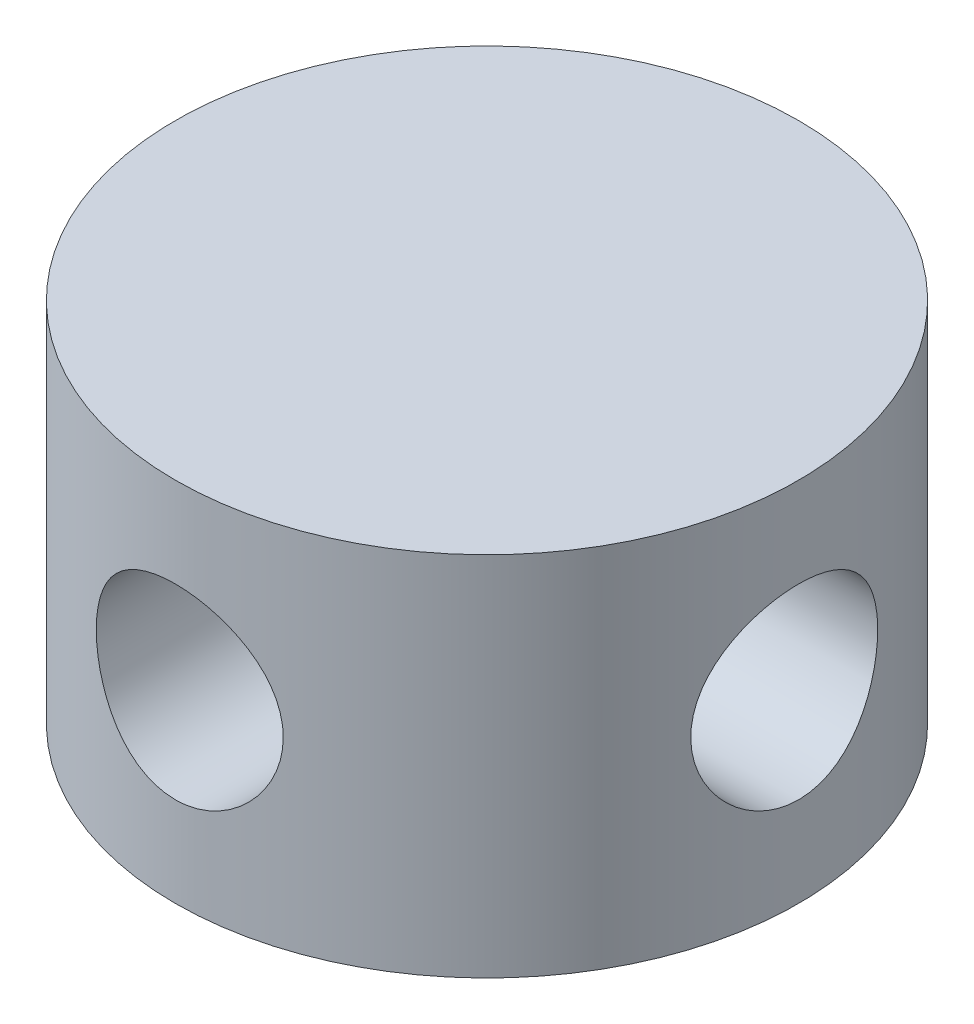
ISO-10303-21;
HEADER;
FILE_DESCRIPTION(('STEP AP214'),'2;1');
FILE_NAME('part.step','',(''),(''),'','','');
FILE_SCHEMA(('AUTOMOTIVE_DESIGN { 1 0 10303 214 1 1 1 1 }'));
ENDSEC;
DATA;
#1=APPLICATION_CONTEXT('core data for automotive mechanical design processes');
#2=APPLICATION_PROTOCOL_DEFINITION('international standard','automotive_design',2000,#1);
#3=PRODUCT_CONTEXT('',#1,'mechanical');
#4=PRODUCT('Part','Part','',(#3));
#5=PRODUCT_RELATED_PRODUCT_CATEGORY('part','',(#4));
#6=PRODUCT_DEFINITION_FORMATION('','',#4);
#7=PRODUCT_DEFINITION_CONTEXT('part definition',#1,'design');
#8=PRODUCT_DEFINITION('design','',#6,#7);
#9=PRODUCT_DEFINITION_SHAPE('','',#8);
#10=(LENGTH_UNIT() NAMED_UNIT(*) SI_UNIT(.MILLI.,.METRE.));
#11=(NAMED_UNIT(*) PLANE_ANGLE_UNIT() SI_UNIT($,.RADIAN.));
#12=(NAMED_UNIT(*) SI_UNIT($,.STERADIAN.) SOLID_ANGLE_UNIT());
#13=UNCERTAINTY_MEASURE_WITH_UNIT(LENGTH_MEASURE(1.E-05),#10,'distance_accuracy_value','');
#14=(GEOMETRIC_REPRESENTATION_CONTEXT(3) GLOBAL_UNCERTAINTY_ASSIGNED_CONTEXT((#13)) GLOBAL_UNIT_ASSIGNED_CONTEXT((#10,
#11,#12)) REPRESENTATION_CONTEXT('',''));
#15=CARTESIAN_POINT('',(0.,0.,0.));
#16=DIRECTION('',(0.,0.,1.));
#17=DIRECTION('',(1.,0.,0.));
#18=AXIS2_PLACEMENT_3D('',#15,#16,#17);
#19=CARTESIAN_POINT('',(0.,20.,0.));
#20=DIRECTION('',(0.,-1.,0.));
#21=DIRECTION('',(0.,0.,-1.));
#22=AXIS2_PLACEMENT_3D('',#19,#20,#21);
#23=CYLINDRICAL_SURFACE('',#22,17.);
#24=CARTESIAN_POINT('',(16.2169664240881,10.,-5.10000000000006));
#25=CARTESIAN_POINT('',(16.2169693147474,9.72053853699297,-5.09999651955021));
#26=CARTESIAN_POINT('',(16.2242692671164,9.44104263790955,-5.07695167768347));
#27=CARTESIAN_POINT('',(16.2525636622905,8.89022215138816,-4.98561871118894));
#28=CARTESIAN_POINT('',(16.2735626807757,8.61890032589522,-4.91731546950155));
#29=CARTESIAN_POINT('',(16.3266674845136,8.09248192387591,-4.73799361117869));
#30=CARTESIAN_POINT('',(16.3587547879105,7.83735917924745,-4.62704603940437));
#31=CARTESIAN_POINT('',(16.4303957066167,7.34928542441603,-4.3658183452096));
#32=CARTESIAN_POINT('',(16.4699504393945,7.11633774047293,-4.21553233465984));
#33=CARTESIAN_POINT('',(16.5534733143162,6.67185427203691,-3.87480164081538));
#34=CARTESIAN_POINT('',(16.5975354825956,6.46112394698262,-3.68332904397749));
#35=CARTESIAN_POINT('',(16.6843053058497,6.07423096550347,-3.26786320777069));
#36=CARTESIAN_POINT('',(16.7270127861219,5.89807275247041,-3.04386579456784));
#37=CARTESIAN_POINT('',(16.8073292956992,5.58182682056676,-2.5639788884986));
#38=CARTESIAN_POINT('',(16.8448146276417,5.44256035689445,-2.30752567254183));
#39=CARTESIAN_POINT('',(16.9093708213033,5.20944331925463,-1.77352379425586));
#40=CARTESIAN_POINT('',(16.9364439288429,5.11558295048468,-1.49597969651896));
#41=CARTESIAN_POINT('',(16.976459964122,4.97860799629227,-0.93610109894488));
#42=CARTESIAN_POINT('',(16.9897849505574,4.93411856598081,-0.654130756442985));
#43=CARTESIAN_POINT('',(17.0021488510459,4.89280109620211,-0.0864342007477273));
#44=CARTESIAN_POINT('',(17.0011907657169,4.89596304603335,0.199291210971204));
#45=CARTESIAN_POINT('',(16.9853665298002,4.94893575304626,0.756741932440475));
#46=CARTESIAN_POINT('',(16.9709442869781,4.99725765895348,1.02862330998046));
#47=CARTESIAN_POINT('',(16.9303517518289,5.13674654238066,1.56022332570457));
#48=CARTESIAN_POINT('',(16.9041807155228,5.22791623320535,1.81994119249776));
#49=CARTESIAN_POINT('',(16.8424175135539,5.45152087962283,2.32338090959415));
#50=CARTESIAN_POINT('',(16.8067191689971,5.58442408954371,2.56688121996063));
#51=CARTESIAN_POINT('',(16.7296877820452,5.88735269825698,3.02859989086321));
#52=CARTESIAN_POINT('',(16.688353403725,6.0573869040796,3.2468122345672));
#53=CARTESIAN_POINT('',(16.6025927165555,6.43747235255154,3.66064563719917));
#54=CARTESIAN_POINT('',(16.5581086407696,6.64881352468632,3.85507157335578));
#55=CARTESIAN_POINT('',(16.4724553163351,7.10153406084096,4.20606015236189));
#56=CARTESIAN_POINT('',(16.4312863973771,7.34291640637865,4.36261903244663));
#57=CARTESIAN_POINT('',(16.3566487081151,7.85201419540269,4.63467584138164));
#58=CARTESIAN_POINT('',(16.3232575613944,8.11995995574973,4.74976563397936));
#59=CARTESIAN_POINT('',(16.2688773443844,8.67266450852362,4.93283433776251));
#60=CARTESIAN_POINT('',(16.2478842285429,8.95741778315959,5.00082861775135));
#61=CARTESIAN_POINT('',(16.2215648849761,9.52428002655414,5.0855421896179));
#62=CARTESIAN_POINT('',(16.2156838749486,9.8060919612504,5.10407817693366));
#63=CARTESIAN_POINT('',(16.2187205428718,10.3688078600227,5.09442220591754));
#64=CARTESIAN_POINT('',(16.2276361492834,10.649711945682,5.06623678862344));
#65=CARTESIAN_POINT('',(16.2587169909066,11.1950604851038,4.96555596152409));
#66=CARTESIAN_POINT('',(16.2805320012653,11.4597429584967,4.89423068866392));
#67=CARTESIAN_POINT('',(16.3345908018511,11.97336574877,4.71065164342945));
#68=CARTESIAN_POINT('',(16.3668362022056,12.2223036280777,4.59839155165364));
#69=CARTESIAN_POINT('',(16.4391983907866,12.7047593778455,4.33268362068108));
#70=CARTESIAN_POINT('',(16.479503216374,12.9376840513517,4.17821118187276));
#71=CARTESIAN_POINT('',(16.5630389919968,13.3749695610147,3.83368025441299));
#72=CARTESIAN_POINT('',(16.6062706408199,13.5793235398835,3.64361324818642));
#73=CARTESIAN_POINT('',(16.6927635406376,13.9616133797701,3.22474745047819));
#74=CARTESIAN_POINT('',(16.7359643321422,14.1382611385557,2.99475762391522));
#75=CARTESIAN_POINT('',(16.8158849594541,14.4504867834944,2.50737006760678));
#76=CARTESIAN_POINT('',(16.8526051170804,14.586066709257,2.24997369984935));
#77=CARTESIAN_POINT('',(16.9152029961486,14.8110001039322,1.71678071599769));
#78=CARTESIAN_POINT('',(16.9411614164488,14.9006988549405,1.4411397149286));
#79=CARTESIAN_POINT('',(16.9796673062922,15.0322071242274,0.877777886115537));
#80=CARTESIAN_POINT('',(16.9922186128101,15.0740303442246,0.590060539006121));
#81=CARTESIAN_POINT('',(17.0022624987674,15.1075583497853,0.0226173232012794));
#82=CARTESIAN_POINT('',(17.0003163737844,15.1011311643867,-0.256989608893115));
#83=CARTESIAN_POINT('',(16.9829069918118,15.0428064495029,-0.810966235959078));
#84=CARTESIAN_POINT('',(16.9674445012379,14.9909114981663,-1.08533622697843));
#85=CARTESIAN_POINT('',(16.924899724181,14.8442803512415,-1.61818176434051));
#86=CARTESIAN_POINT('',(16.8979439986215,14.7500101857942,-1.87679635299416));
#87=CARTESIAN_POINT('',(16.8352000633492,14.5217214906747,-2.37467300835767));
#88=CARTESIAN_POINT('',(16.7994104023277,14.3876964290238,-2.61393188657438));
#89=CARTESIAN_POINT('',(16.7213348381292,14.0787302447412,-3.07462643422755));
#90=CARTESIAN_POINT('',(16.6788777152854,13.9026171380099,-3.29524685025187));
#91=CARTESIAN_POINT('',(16.592800265335,13.516584679656,-3.70442774258546));
#92=CARTESIAN_POINT('',(16.5491796062288,13.3066555910995,-3.89297895268098));
#93=CARTESIAN_POINT('',(16.4641831410189,12.8514413537876,-4.23831315938304));
#94=CARTESIAN_POINT('',(16.4229129898929,12.6052889186445,-4.3939818316433));
#95=CARTESIAN_POINT('',(16.3489866136246,12.089112408027,-4.66154665985053));
#96=CARTESIAN_POINT('',(16.3163262518719,11.8190998798043,-4.77346384891451));
#97=CARTESIAN_POINT('',(16.2665457687777,11.2928825325027,-4.94026604614784));
#98=CARTESIAN_POINT('',(16.2481292646796,11.038330600425,-5.00000120638931));
#99=CARTESIAN_POINT('',(16.2233394482018,10.522528243524,-5.07986584038757));
#100=CARTESIAN_POINT('',(16.2169637215005,10.2612791722088,-5.10000325400526));
#101=CARTESIAN_POINT('',(16.2169664240881,10.,-5.10000000000006));
#102=B_SPLINE_CURVE_WITH_KNOTS('',3,(#24,#25,#26,#27,#28,#29,#30,#31,#32,#33,#34,#35,#36,#37,
#38,#39,#40,#41,#42,#43,#44,#45,#46,#47,#48,#49,#50,#51,#52,#53,#54,#55,#56,#57,#58,#59,#60,#61,
#62,#63,#64,#65,#66,#67,#68,#69,#70,#71,#72,#73,#74,#75,#76,#77,#78,#79,#80,#81,#82,#83,#84,#85,
#86,#87,#88,#89,#90,#91,#92,#93,#94,#95,#96,#97,#98,#99,#100,#101),.UNSPECIFIED.,.T.,.F.,(4,2,2,
2,2,2,2,2,2,2,2,2,2,2,2,2,2,2,2,2,2,2,2,2,2,2,2,2,2,2,2,2,2,2,2,2,2,2,4),(0.,0.837420564112844,
1.6751209817426,2.51143180918506,3.34786788625834,4.20828710027145,5.06881682762327,
5.94714193530391,6.82527748998781,7.67829276508496,8.53112883944897,9.35680428368992,
10.1825320202728,11.017877117413,11.8534205640882,12.7211729987914,13.5890116247233,
14.4651721004139,15.3410465214545,16.1842747469591,17.0273849297397,17.8485922280083,
18.6699263556453,19.5133048816078,20.3568854816719,21.232303207509,22.1076774491114,
22.9763633217756,23.8448005190257,24.67979433307,25.5147408037122,26.340721293744,
27.1668375727954,28.0193873199412,28.8721829895048,29.7503957488581,30.6281857949063,
31.4112792312854,32.1942156312733),.UNSPECIFIED.);
#103=CARTESIAN_POINT('',(16.2169664240881,10.,-5.10000000000006));
#104=VERTEX_POINT('',#103);
#105=EDGE_CURVE('E10',#104,#104,#102,.T.);
#106=ORIENTED_EDGE('',*,*,#105,.T.);
#107=EDGE_LOOP('',(#106));
#108=FACE_BOUND('',#107,.T.);
#109=CARTESIAN_POINT('',(0.,15.1,-17.));
#110=CARTESIAN_POINT('',(-0.279781283361213,15.0999966085514,-16.9999975945186));
#111=CARTESIAN_POINT('',(-0.559596882395174,15.0769008636785,-16.9930271335941));
#112=CARTESIAN_POINT('',(-1.11107962603662,14.9853473956448,-16.9659015901859));
#113=CARTESIAN_POINT('',(-1.38274431499892,14.9168761427205,-16.9457425752509));
#114=CARTESIAN_POINT('',(-1.90989120636529,14.7370635425052,-16.8944487850611));
#115=CARTESIAN_POINT('',(-2.16539663894391,14.6257854432961,-16.8633302085095));
#116=CARTESIAN_POINT('',(-2.654122215581,14.3637772836097,-16.7933517140849));
#117=CARTESIAN_POINT('',(-2.8873393893982,14.2130419748537,-16.7544907665489));
#118=CARTESIAN_POINT('',(-3.33156411042338,13.8718383745949,-16.6719250645352));
#119=CARTESIAN_POINT('',(-3.54184144222564,13.6804434719952,-16.6281210442669));
#120=CARTESIAN_POINT('',(-3.92784731139813,13.2653286182981,-16.5411983632274));
#121=CARTESIAN_POINT('',(-4.10357003515212,13.041603238748,-16.4980798189033));
#122=CARTESIAN_POINT('',(-4.41932128258908,12.561999439696,-16.4163598755112));
#123=CARTESIAN_POINT('',(-4.558458506686,12.3055112327279,-16.3778818255282));
#124=CARTESIAN_POINT('',(-4.79132742227216,11.7714365357169,-16.3112830923696));
#125=CARTESIAN_POINT('',(-4.88507001726103,11.4938551306756,-16.2831599224074));
#126=CARTESIAN_POINT('',(-5.02185554522633,10.9336730951322,-16.2414896087455));
#127=CARTESIAN_POINT('',(-5.06624467198061,10.6514306708506,-16.2275563570039));
#128=CARTESIAN_POINT('',(-5.10726684089727,10.083187268875,-16.2146948515223));
#129=CARTESIAN_POINT('',(-5.10391145388652,9.79718721862276,-16.2157629622189));
#130=CARTESIAN_POINT('',(-5.05059722478317,9.2404947106987,-16.2324412979583));
#131=CARTESIAN_POINT('',(-5.00232497888911,8.96962234867081,-16.2475252110391));
#132=CARTESIAN_POINT('',(-4.86327229447819,8.44001272657822,-16.2896841104336));
#133=CARTESIAN_POINT('',(-4.77248766080649,8.18127666690593,-16.3167602801381));
#134=CARTESIAN_POINT('',(-4.54974490623814,7.67915881118311,-16.3802729249148));
#135=CARTESIAN_POINT('',(-4.41723977578132,7.43603591456006,-16.4168325480405));
#136=CARTESIAN_POINT('',(-4.11519756801175,6.9749111251574,-16.495133557904));
#137=CARTESIAN_POINT('',(-3.94565151608705,6.75691533999098,-16.5368761993709));
#138=CARTESIAN_POINT('',(-3.56596388602956,6.34266695141139,-16.6229743841578));
#139=CARTESIAN_POINT('',(-3.35442268538797,6.14770254229972,-16.6673662465644));
#140=CARTESIAN_POINT('',(-2.90109508166722,5.79571645418095,-16.7522162981433));
#141=CARTESIAN_POINT('',(-2.65930677632695,5.63869716339079,-16.7926742396239));
#142=CARTESIAN_POINT('',(-2.1500071303656,5.36627626362008,-16.865467442364));
#143=CARTESIAN_POINT('',(-1.88233434914305,5.25116044475052,-16.8977464847232));
#144=CARTESIAN_POINT('',(-1.33023441305195,5.06796139366121,-16.950139742295));
#145=CARTESIAN_POINT('',(-1.04581195540457,4.99986504298952,-16.9702573503578));
#146=CARTESIAN_POINT('',(-0.479237625072331,4.91478259514207,-16.9955243978804));
#147=CARTESIAN_POINT('',(-0.197370331844035,4.89605060827453,-17.0011849142049));
#148=CARTESIAN_POINT('',(0.365498659799505,4.90533512942107,-16.9983993902198));
#149=CARTESIAN_POINT('',(0.646500468748656,4.9333453968149,-16.9899552330437));
#150=CARTESIAN_POINT('',(1.19307225805297,5.03390767777909,-16.9602436975635));
#151=CARTESIAN_POINT('',(1.45884742688818,5.10543951777496,-16.9392702131801));
#152=CARTESIAN_POINT('',(1.97456577244537,5.28978699144588,-16.8869278266122));
#153=CARTESIAN_POINT('',(2.22450704188699,5.40260758752873,-16.8555576749172));
#154=CARTESIAN_POINT('',(2.70788644416758,5.66926076263585,-16.7847682479447));
#155=CARTESIAN_POINT('',(2.94080900907887,5.82398175922313,-16.7451795482078));
#156=CARTESIAN_POINT('',(3.37797924713251,6.16896416377954,-16.662497937988));
#157=CARTESIAN_POINT('',(3.5822197100102,6.35923448041801,-16.6194041506611));
#158=CARTESIAN_POINT('',(3.96391531473489,6.77811684845585,-16.5326078435461));
#159=CARTESIAN_POINT('',(4.14012836187102,7.00787037762421,-16.4889400511137));
#160=CARTESIAN_POINT('',(4.45158583245331,7.49463499264571,-16.4076015181251));
#161=CARTESIAN_POINT('',(4.5868313302024,7.75164536349679,-16.3699306203231));
#162=CARTESIAN_POINT('',(4.81158980232337,8.28481047026707,-16.3052844468473));
#163=CARTESIAN_POINT('',(4.90131579585836,8.56086903422863,-16.2782594864495));
#164=CARTESIAN_POINT('',(5.0327388477152,9.1251390943628,-16.2381142085755));
#165=CARTESIAN_POINT('',(5.07445236528343,9.41334639066233,-16.2249891261796));
#166=CARTESIAN_POINT('',(5.10754747248881,9.98082916252063,-16.2145990640065));
#167=CARTESIAN_POINT('',(5.10095388047007,10.259976413568,-16.2166960099067));
#168=CARTESIAN_POINT('',(5.04245518510638,10.8129879515621,-16.2349796406672));
#169=CARTESIAN_POINT('',(4.99055189623993,11.0868524496137,-16.2511657613103));
#170=CARTESIAN_POINT('',(4.84421421934766,11.6182143570477,-16.2953759656171));
#171=CARTESIAN_POINT('',(4.75031596724221,11.8758727770196,-16.3232505547839));
#172=CARTESIAN_POINT('',(4.5230712421165,12.3719842919905,-16.3876694826895));
#173=CARTESIAN_POINT('',(4.38971721873728,12.6104336999814,-16.4242154805464));
#174=CARTESIAN_POINT('',(4.08165796937298,13.0707545961893,-16.5035209985408));
#175=CARTESIAN_POINT('',(3.90562338716193,13.2917057882846,-16.5464583655859));
#176=CARTESIAN_POINT('',(3.51959277741244,13.7015884942475,-16.6328448952841));
#177=CARTESIAN_POINT('',(3.30958793825726,13.8905116741906,-16.6762941880082));
#178=CARTESIAN_POINT('',(2.85418359142308,14.2364796018029,-16.7603318434067));
#179=CARTESIAN_POINT('',(2.60792881168807,14.3924309193086,-16.8007994320342));
#180=CARTESIAN_POINT('',(2.09148067154399,14.6604995776737,-16.8728631354964));
#181=CARTESIAN_POINT('',(1.82129858019644,14.7726374201333,-16.904463397656));
#182=CARTESIAN_POINT('',(1.29457622302796,14.9398439372193,-16.9524739489565));
#183=CARTESIAN_POINT('',(1.0396756706444,14.999739687803,-16.9701489309564));
#184=CARTESIAN_POINT('',(0.523192663784646,15.0798159858214,-16.9939121128127));
#185=CARTESIAN_POINT('',(0.261611333517667,15.1000031711964,-17.0000022492612));
#186=CARTESIAN_POINT('',(0.,15.1,-17.));
#187=B_SPLINE_CURVE_WITH_KNOTS('',3,(#109,#110,#111,#112,#113,#114,#115,#116,#117,#118,#119,
#120,#121,#122,#123,#124,#125,#126,#127,#128,#129,#130,#131,#132,#133,#134,#135,#136,#137,#138,
#139,#140,#141,#142,#143,#144,#145,#146,#147,#148,#149,#150,#151,#152,#153,#154,#155,#156,#157,
#158,#159,#160,#161,#162,#163,#164,#165,#166,#167,#168,#169,#170,#171,#172,#173,#174,#175,#176,
#177,#178,#179,#180,#181,#182,#183,#184,#185,#186),.UNSPECIFIED.,.T.,.F.,(4,2,2,2,2,2,2,2,2,2,2,
2,2,2,2,2,2,2,2,2,2,2,2,2,2,2,2,2,2,2,2,2,2,2,2,2,2,2,4),(0.,0.838382892282875,1.6770158804764,
2.51441449942297,3.35192455900318,4.21109050023851,5.07040086781352,5.94903035415395,
6.82744869450187,7.68126943815663,8.5348832628813,9.3576845677823,10.1805670844594,
11.0147224992894,11.8490802454782,12.718281537725,13.5875375221437,14.4626155940647,
15.3374494200668,16.1808995209979,17.0242370207984,17.8485293872864,18.6729208562741,
19.5163843939862,20.3600595880938,21.2343736110631,22.1086647046785,22.9788257084299,
23.8486883217369,24.6823052860425,25.5158888687368,26.3391213739349,27.162511517048,
28.01589547336,28.8695011467574,29.7480618695692,30.6262109944804,31.410277525878,
32.1942129765041),.UNSPECIFIED.);
#188=CARTESIAN_POINT('',(0.,15.1,-17.));
#189=VERTEX_POINT('',#188);
#190=EDGE_CURVE('E41',#189,#189,#187,.T.);
#191=ORIENTED_EDGE('',*,*,#190,.T.);
#192=EDGE_LOOP('',(#191));
#193=FACE_BOUND('',#192,.T.);
#194=CARTESIAN_POINT('',(-16.216966424088,10.,5.10000000000017));
#195=CARTESIAN_POINT('',(-16.2169693147474,9.72053853699297,5.09999651955033));
#196=CARTESIAN_POINT('',(-16.2242692671164,9.44104263790955,5.07695167768359));
#197=CARTESIAN_POINT('',(-16.2525636622905,8.89022215138816,4.98561871118906));
#198=CARTESIAN_POINT('',(-16.2735626807757,8.61890032589522,4.91731546950167));
#199=CARTESIAN_POINT('',(-16.3266674845136,8.09248192387591,4.73799361117881));
#200=CARTESIAN_POINT('',(-16.3587547879104,7.83735917924745,4.62704603940449));
#201=CARTESIAN_POINT('',(-16.4303957066167,7.34928542441603,4.36581834520972));
#202=CARTESIAN_POINT('',(-16.4699504393945,7.11633774047292,4.21553233465995));
#203=CARTESIAN_POINT('',(-16.5534733143161,6.67185427203691,3.8748016408155));
#204=CARTESIAN_POINT('',(-16.5975354825956,6.46112394698262,3.6833290439776));
#205=CARTESIAN_POINT('',(-16.6843053058497,6.07423096550347,3.26786320777081));
#206=CARTESIAN_POINT('',(-16.7270127861219,5.89807275247041,3.04386579456795));
#207=CARTESIAN_POINT('',(-16.8073292956992,5.58182682056676,2.56397888849872));
#208=CARTESIAN_POINT('',(-16.8448146276417,5.44256035689445,2.30752567254195));
#209=CARTESIAN_POINT('',(-16.9093708213033,5.20944331925463,1.77352379425598));
#210=CARTESIAN_POINT('',(-16.9364439288428,5.11558295048467,1.49597969651908));
#211=CARTESIAN_POINT('',(-16.976459964122,4.97860799629227,0.936101098945));
#212=CARTESIAN_POINT('',(-16.9897849505574,4.93411856598081,0.654130756443105));
#213=CARTESIAN_POINT('',(-17.0021488510459,4.89280109620211,0.0864342007478476));
#214=CARTESIAN_POINT('',(-17.0011907657169,4.89596304603335,-0.199291210971084));
#215=CARTESIAN_POINT('',(-16.9853665298002,4.94893575304626,-0.756741932440355));
#216=CARTESIAN_POINT('',(-16.9709442869781,4.99725765895348,-1.02862330998034));
#217=CARTESIAN_POINT('',(-16.9303517518289,5.13674654238066,-1.56022332570445));
#218=CARTESIAN_POINT('',(-16.9041807155228,5.22791623320535,-1.81994119249764));
#219=CARTESIAN_POINT('',(-16.8424175135539,5.45152087962283,-2.32338090959403));
#220=CARTESIAN_POINT('',(-16.8067191689972,5.58442408954371,-2.56688121996051));
#221=CARTESIAN_POINT('',(-16.7296877820453,5.88735269825698,-3.02859989086309));
#222=CARTESIAN_POINT('',(-16.6883534037251,6.05738690407959,-3.24681223456708));
#223=CARTESIAN_POINT('',(-16.6025927165555,6.43747235255154,-3.66064563719905));
#224=CARTESIAN_POINT('',(-16.5581086407696,6.64881352468632,-3.85507157335567));
#225=CARTESIAN_POINT('',(-16.4724553163351,7.10153406084096,-4.20606015236177));
#226=CARTESIAN_POINT('',(-16.4312863973772,7.34291640637865,-4.36261903244651));
#227=CARTESIAN_POINT('',(-16.3566487081152,7.85201419540269,-4.63467584138152));
#228=CARTESIAN_POINT('',(-16.3232575613944,8.11995995574973,-4.74976563397925));
#229=CARTESIAN_POINT('',(-16.2688773443845,8.67266450852362,-4.9328343377624));
#230=CARTESIAN_POINT('',(-16.2478842285429,8.95741778315959,-5.00082861775123));
#231=CARTESIAN_POINT('',(-16.2215648849761,9.52428002655414,-5.08554218961778));
#232=CARTESIAN_POINT('',(-16.2156838749487,9.8060919612504,-5.10407817693355));
#233=CARTESIAN_POINT('',(-16.2187205428719,10.3688078600227,-5.09442220591743));
#234=CARTESIAN_POINT('',(-16.2276361492834,10.649711945682,-5.06623678862333));
#235=CARTESIAN_POINT('',(-16.2587169909067,11.1950604851038,-4.96555596152397));
#236=CARTESIAN_POINT('',(-16.2805320012653,11.4597429584967,-4.89423068866381));
#237=CARTESIAN_POINT('',(-16.3345908018512,11.97336574877,-4.71065164342934));
#238=CARTESIAN_POINT('',(-16.3668362022057,12.2223036280777,-4.59839155165353));
#239=CARTESIAN_POINT('',(-16.4391983907866,12.7047593778455,-4.33268362068096));
#240=CARTESIAN_POINT('',(-16.479503216374,12.9376840513517,-4.17821118187264));
#241=CARTESIAN_POINT('',(-16.5630389919968,13.3749695610147,-3.83368025441287));
#242=CARTESIAN_POINT('',(-16.6062706408199,13.5793235398835,-3.6436132481863));
#243=CARTESIAN_POINT('',(-16.6927635406376,13.9616133797701,-3.22474745047807));
#244=CARTESIAN_POINT('',(-16.7359643321422,14.1382611385557,-2.99475762391511));
#245=CARTESIAN_POINT('',(-16.8158849594541,14.4504867834944,-2.50737006760667));
#246=CARTESIAN_POINT('',(-16.8526051170804,14.586066709257,-2.24997369984923));
#247=CARTESIAN_POINT('',(-16.9152029961486,14.8110001039322,-1.71678071599758));
#248=CARTESIAN_POINT('',(-16.9411614164488,14.9006988549405,-1.44113971492848));
#249=CARTESIAN_POINT('',(-16.9796673062922,15.0322071242274,-0.87777788611542));
#250=CARTESIAN_POINT('',(-16.9922186128101,15.0740303442246,-0.590060539006004));
#251=CARTESIAN_POINT('',(-17.0022624987674,15.1075583497853,-0.0226173232011619));
#252=CARTESIAN_POINT('',(-17.0003163737844,15.1011311643867,0.256989608893232));
#253=CARTESIAN_POINT('',(-16.9829069918118,15.0428064495029,0.810966235959195));
#254=CARTESIAN_POINT('',(-16.9674445012379,14.9909114981663,1.08533622697854));
#255=CARTESIAN_POINT('',(-16.9248997241809,14.8442803512415,1.61818176434062));
#256=CARTESIAN_POINT('',(-16.8979439986215,14.7500101857942,1.87679635299428));
#257=CARTESIAN_POINT('',(-16.8352000633492,14.5217214906747,2.37467300835778));
#258=CARTESIAN_POINT('',(-16.7994104023277,14.3876964290238,2.61393188657449));
#259=CARTESIAN_POINT('',(-16.7213348381292,14.0787302447412,3.07462643422766));
#260=CARTESIAN_POINT('',(-16.6788777152854,13.9026171380099,3.29524685025199));
#261=CARTESIAN_POINT('',(-16.592800265335,13.516584679656,3.70442774258557));
#262=CARTESIAN_POINT('',(-16.5491796062288,13.3066555910995,3.89297895268109));
#263=CARTESIAN_POINT('',(-16.4641831410189,12.8514413537876,4.23831315938315));
#264=CARTESIAN_POINT('',(-16.4229129898929,12.6052889186445,4.39398183164342));
#265=CARTESIAN_POINT('',(-16.3489866136246,12.089112408027,4.66154665985064));
#266=CARTESIAN_POINT('',(-16.3163262518718,11.8190998798043,4.77346384891463));
#267=CARTESIAN_POINT('',(-16.2665457687776,11.2928825325027,4.94026604614795));
#268=CARTESIAN_POINT('',(-16.2481292646795,11.038330600425,5.00000120638943));
#269=CARTESIAN_POINT('',(-16.2233394482017,10.522528243524,5.07986584038768));
#270=CARTESIAN_POINT('',(-16.2169637215004,10.2612791722088,5.10000325400537));
#271=CARTESIAN_POINT('',(-16.216966424088,10.,5.10000000000017));
#272=B_SPLINE_CURVE_WITH_KNOTS('',3,(#194,#195,#196,#197,#198,#199,#200,#201,#202,#203,#204,
#205,#206,#207,#208,#209,#210,#211,#212,#213,#214,#215,#216,#217,#218,#219,#220,#221,#222,#223,
#224,#225,#226,#227,#228,#229,#230,#231,#232,#233,#234,#235,#236,#237,#238,#239,#240,#241,#242,
#243,#244,#245,#246,#247,#248,#249,#250,#251,#252,#253,#254,#255,#256,#257,#258,#259,#260,#261,
#262,#263,#264,#265,#266,#267,#268,#269,#270,#271),.UNSPECIFIED.,.T.,.F.,(4,2,2,2,2,2,2,2,2,2,2,
2,2,2,2,2,2,2,2,2,2,2,2,2,2,2,2,2,2,2,2,2,2,2,2,2,2,2,4),(0.,0.837420564112842,1.6751209817426,
2.51143180918506,3.34786788625834,4.20828710027145,5.06881682762327,5.94714193530391,
6.82527748998781,7.67829276508496,8.53112883944897,9.35680428368992,10.1825320202728,
11.017877117413,11.8534205640882,12.7211729987914,13.5890116247233,14.4651721004139,
15.3410465214545,16.1842747469591,17.0273849297397,17.8485922280083,18.6699263556453,
19.5133048816078,20.3568854816719,21.232303207509,22.1076774491114,22.9763633217756,
23.8448005190258,24.67979433307,25.5147408037122,26.340721293744,27.1668375727954,
28.0193873199412,28.8721829895048,29.7503957488581,30.6281857949063,31.4112792312854,
32.1942156312733),.UNSPECIFIED.);
#273=CARTESIAN_POINT('',(-16.216966424088,10.,5.10000000000017));
#274=VERTEX_POINT('',#273);
#275=EDGE_CURVE('E45',#274,#274,#272,.T.);
#276=ORIENTED_EDGE('',*,*,#275,.T.);
#277=EDGE_LOOP('',(#276));
#278=FACE_BOUND('',#277,.T.);
#279=CARTESIAN_POINT('',(5.1,10.,16.2169664240881));
#280=CARTESIAN_POINT('',(5.09999651955016,9.72053853699297,16.2169693147474));
#281=CARTESIAN_POINT('',(5.07695167768342,9.44104263790955,16.2242692671164));
#282=CARTESIAN_POINT('',(4.98561871118889,8.89022215138816,16.2525636622905));
#283=CARTESIAN_POINT('',(4.91731546950149,8.61890032589522,16.2735626807757));
#284=CARTESIAN_POINT('',(4.73799361117864,8.09248192387591,16.3266674845137));
#285=CARTESIAN_POINT('',(4.62704603940432,7.83735917924745,16.3587547879105));
#286=CARTESIAN_POINT('',(4.36581834520955,7.34928542441603,16.4303957066167));
#287=CARTESIAN_POINT('',(4.21553233465978,7.11633774047293,16.4699504393945));
#288=CARTESIAN_POINT('',(3.87480164081533,6.67185427203691,16.5534733143162));
#289=CARTESIAN_POINT('',(3.68332904397743,6.46112394698262,16.5975354825957));
#290=CARTESIAN_POINT('',(3.26786320777063,6.07423096550347,16.6843053058497));
#291=CARTESIAN_POINT('',(3.04386579456778,5.89807275247041,16.727012786122));
#292=CARTESIAN_POINT('',(2.56397888849855,5.58182682056676,16.8073292956992));
#293=CARTESIAN_POINT('',(2.30752567254177,5.44256035689445,16.8448146276417));
#294=CARTESIAN_POINT('',(1.7735237942558,5.20944331925463,16.9093708213033));
#295=CARTESIAN_POINT('',(1.4959796965189,5.11558295048467,16.9364439288429));
#296=CARTESIAN_POINT('',(0.936101098944822,4.97860799629227,16.976459964122));
#297=CARTESIAN_POINT('',(0.654130756442926,4.93411856598081,16.9897849505574));
#298=CARTESIAN_POINT('',(0.0864342007476682,4.89280109620211,17.0021488510459));
#299=CARTESIAN_POINT('',(-0.199291210971263,4.89596304603335,17.0011907657169));
#300=CARTESIAN_POINT('',(-0.756741932440534,4.94893575304626,16.9853665298002));
#301=CARTESIAN_POINT('',(-1.02862330998052,4.99725765895348,16.9709442869781));
#302=CARTESIAN_POINT('',(-1.56022332570463,5.13674654238066,16.9303517518289));
#303=CARTESIAN_POINT('',(-1.81994119249782,5.22791623320535,16.9041807155228));
#304=CARTESIAN_POINT('',(-2.32338090959421,5.45152087962283,16.8424175135539));
#305=CARTESIAN_POINT('',(-2.56688121996069,5.58442408954371,16.8067191689971));
#306=CARTESIAN_POINT('',(-3.02859989086327,5.88735269825698,16.7296877820452));
#307=CARTESIAN_POINT('',(-3.24681223456726,6.0573869040796,16.688353403725));
#308=CARTESIAN_POINT('',(-3.66064563719922,6.43747235255154,16.6025927165555));
#309=CARTESIAN_POINT('',(-3.85507157335584,6.64881352468632,16.5581086407696));
#310=CARTESIAN_POINT('',(-4.20606015236195,7.10153406084096,16.472455316335));
#311=CARTESIAN_POINT('',(-4.36261903244668,7.34291640637865,16.4312863973771));
#312=CARTESIAN_POINT('',(-4.63467584138169,7.85201419540269,16.3566487081151));
#313=CARTESIAN_POINT('',(-4.74976563397942,8.11995995574973,16.3232575613943));
#314=CARTESIAN_POINT('',(-4.93283433776257,8.67266450852361,16.2688773443844));
#315=CARTESIAN_POINT('',(-5.0008286177514,8.95741778315959,16.2478842285429));
#316=CARTESIAN_POINT('',(-5.08554218961796,9.52428002655414,16.2215648849761));
#317=CARTESIAN_POINT('',(-5.10407817693372,9.8060919612504,16.2156838749486));
#318=CARTESIAN_POINT('',(-5.0944222059176,10.3688078600227,16.2187205428718));
#319=CARTESIAN_POINT('',(-5.0662367886235,10.649711945682,16.2276361492834));
#320=CARTESIAN_POINT('',(-4.96555596152414,11.1950604851038,16.2587169909066));
#321=CARTESIAN_POINT('',(-4.89423068866398,11.4597429584967,16.2805320012652));
#322=CARTESIAN_POINT('',(-4.71065164342951,11.97336574877,16.3345908018511));
#323=CARTESIAN_POINT('',(-4.5983915516537,12.2223036280777,16.3668362022056));
#324=CARTESIAN_POINT('',(-4.33268362068114,12.7047593778455,16.4391983907866));
#325=CARTESIAN_POINT('',(-4.17821118187282,12.9376840513517,16.4795032163739));
#326=CARTESIAN_POINT('',(-3.83368025441304,13.3749695610147,16.5630389919968));
#327=CARTESIAN_POINT('',(-3.64361324818647,13.5793235398835,16.6062706408199));
#328=CARTESIAN_POINT('',(-3.22474745047824,13.9616133797701,16.6927635406376));
#329=CARTESIAN_POINT('',(-2.99475762391528,14.1382611385557,16.7359643321422));
#330=CARTESIAN_POINT('',(-2.50737006760684,14.4504867834944,16.8158849594541));
#331=CARTESIAN_POINT('',(-2.24997369984941,14.586066709257,16.8526051170804));
#332=CARTESIAN_POINT('',(-1.71678071599776,14.8110001039322,16.9152029961486));
#333=CARTESIAN_POINT('',(-1.44113971492866,14.9006988549405,16.9411614164488));
#334=CARTESIAN_POINT('',(-0.877777886115598,15.0322071242274,16.9796673062921));
#335=CARTESIAN_POINT('',(-0.590060539006182,15.0740303442246,16.9922186128101));
#336=CARTESIAN_POINT('',(-0.0226173232013399,15.1075583497853,17.0022624987674));
#337=CARTESIAN_POINT('',(0.256989608893054,15.1011311643867,17.0003163737844));
#338=CARTESIAN_POINT('',(0.810966235959017,15.0428064495029,16.9829069918118));
#339=CARTESIAN_POINT('',(1.08533622697837,14.9909114981663,16.9674445012379));
#340=CARTESIAN_POINT('',(1.61818176434044,14.8442803512415,16.924899724181));
#341=CARTESIAN_POINT('',(1.8767963529941,14.7500101857942,16.8979439986215));
#342=CARTESIAN_POINT('',(2.37467300835761,14.5217214906747,16.8352000633492));
#343=CARTESIAN_POINT('',(2.61393188657432,14.3876964290238,16.7994104023277));
#344=CARTESIAN_POINT('',(3.07462643422749,14.0787302447412,16.7213348381292));
#345=CARTESIAN_POINT('',(3.29524685025182,13.9026171380099,16.6788777152854));
#346=CARTESIAN_POINT('',(3.7044277425854,13.516584679656,16.592800265335));
#347=CARTESIAN_POINT('',(3.89297895268092,13.3066555910995,16.5491796062288));
#348=CARTESIAN_POINT('',(4.23831315938298,12.8514413537876,16.464183141019));
#349=CARTESIAN_POINT('',(4.39398183164325,12.6052889186445,16.4229129898929));
#350=CARTESIAN_POINT('',(4.66154665985047,12.089112408027,16.3489866136246));
#351=CARTESIAN_POINT('',(4.77346384891446,11.8190998798043,16.3163262518719));
#352=CARTESIAN_POINT('',(4.94026604614778,11.2928825325027,16.2665457687777));
#353=CARTESIAN_POINT('',(5.00000120638926,11.038330600425,16.2481292646796));
#354=CARTESIAN_POINT('',(5.07986584038751,10.522528243524,16.2233394482018));
#355=CARTESIAN_POINT('',(5.1000032540052,10.2612791722088,16.2169637215005));
#356=CARTESIAN_POINT('',(5.1,10.,16.2169664240881));
#357=B_SPLINE_CURVE_WITH_KNOTS('',3,(#279,#280,#281,#282,#283,#284,#285,#286,#287,#288,#289,
#290,#291,#292,#293,#294,#295,#296,#297,#298,#299,#300,#301,#302,#303,#304,#305,#306,#307,#308,
#309,#310,#311,#312,#313,#314,#315,#316,#317,#318,#319,#320,#321,#322,#323,#324,#325,#326,#327,
#328,#329,#330,#331,#332,#333,#334,#335,#336,#337,#338,#339,#340,#341,#342,#343,#344,#345,#346,
#347,#348,#349,#350,#351,#352,#353,#354,#355,#356),.UNSPECIFIED.,.T.,.F.,(4,2,2,2,2,2,2,2,2,2,2,
2,2,2,2,2,2,2,2,2,2,2,2,2,2,2,2,2,2,2,2,2,2,2,2,2,2,2,4),(0.,0.837420564112844,1.6751209817426,
2.51143180918506,3.34786788625834,4.20828710027145,5.06881682762327,5.94714193530391,
6.82527748998782,7.67829276508496,8.53112883944897,9.35680428368992,10.1825320202728,
11.017877117413,11.8534205640882,12.7211729987914,13.5890116247233,14.4651721004139,
15.3410465214545,16.1842747469591,17.0273849297397,17.8485922280083,18.6699263556453,
19.5133048816078,20.3568854816719,21.232303207509,22.1076774491114,22.9763633217756,
23.8448005190257,24.67979433307,25.5147408037122,26.340721293744,27.1668375727954,
28.0193873199412,28.8721829895048,29.7503957488581,30.6281857949063,31.4112792312854,
32.1942156312732),.UNSPECIFIED.);
#358=CARTESIAN_POINT('',(5.1,10.,16.2169664240881));
#359=VERTEX_POINT('',#358);
#360=EDGE_CURVE('E88',#359,#359,#357,.T.);
#361=ORIENTED_EDGE('',*,*,#360,.T.);
#362=EDGE_LOOP('',(#361));
#363=FACE_BOUND('',#362,.T.);
#364=CARTESIAN_POINT('',(0.,20.,0.));
#365=DIRECTION('',(0.,1.,0.));
#366=DIRECTION('',(0.,0.,1.));
#367=AXIS2_PLACEMENT_3D('',#364,#365,#366);
#368=CIRCLE('',#367,17.);
#369=CARTESIAN_POINT('',(0.,20.,17.));
#370=VERTEX_POINT('',#369);
#371=EDGE_CURVE('E94',#370,#370,#368,.T.);
#372=ORIENTED_EDGE('',*,*,#371,.F.);
#373=EDGE_LOOP('',(#372));
#374=FACE_BOUND('',#373,.T.);
#375=CARTESIAN_POINT('',(0.,0.,0.));
#376=DIRECTION('',(0.,1.,0.));
#377=DIRECTION('',(0.,0.,1.));
#378=AXIS2_PLACEMENT_3D('',#375,#376,#377);
#379=CIRCLE('',#378,17.);
#380=CARTESIAN_POINT('',(0.,0.,17.));
#381=VERTEX_POINT('',#380);
#382=EDGE_CURVE('E95',#381,#381,#379,.T.);
#383=ORIENTED_EDGE('',*,*,#382,.T.);
#384=EDGE_LOOP('',(#383));
#385=FACE_BOUND('',#384,.T.);
#386=ADVANCED_FACE('F33',(#108,#193,#278,#363,#374,#385),#23,.T.);
#387=CARTESIAN_POINT('',(0.,20.,0.));
#388=DIRECTION('',(0.,1.,0.));
#389=DIRECTION('',(0.,0.,1.));
#390=AXIS2_PLACEMENT_3D('',#387,#388,#389);
#391=PLANE('',#390);
#392=ORIENTED_EDGE('',*,*,#371,.T.);
#393=EDGE_LOOP('',(#392));
#394=FACE_BOUND('',#393,.T.);
#395=ADVANCED_FACE('F103',(#394),#391,.T.);
#396=CARTESIAN_POINT('',(0.,0.,0.));
#397=DIRECTION('',(0.,1.,0.));
#398=DIRECTION('',(0.,0.,1.));
#399=AXIS2_PLACEMENT_3D('',#396,#397,#398);
#400=PLANE('',#399);
#401=CARTESIAN_POINT('',(0.,0.,0.));
#402=DIRECTION('',(0.,-1.,0.));
#403=DIRECTION('',(0.,0.,-1.));
#404=AXIS2_PLACEMENT_3D('',#401,#402,#403);
#405=CIRCLE('',#404,13.5);
#406=CARTESIAN_POINT('',(0.,0.,-13.5));
#407=VERTEX_POINT('',#406);
#408=EDGE_CURVE('E143',#407,#407,#405,.T.);
#409=ORIENTED_EDGE('',*,*,#408,.F.);
#410=EDGE_LOOP('',(#409));
#411=FACE_BOUND('',#410,.T.);
#412=ORIENTED_EDGE('',*,*,#382,.F.);
#413=EDGE_LOOP('',(#412));
#414=FACE_BOUND('',#413,.T.);
#415=ADVANCED_FACE('F101',(#411,#414),#400,.F.);
#416=CARTESIAN_POINT('',(0.,10.,7.));
#417=DIRECTION('',(0.,0.,1.));
#418=DIRECTION('',(1.,0.,0.));
#419=AXIS2_PLACEMENT_3D('',#416,#417,#418);
#420=CYLINDRICAL_SURFACE('',#419,5.1);
#421=CARTESIAN_POINT('',(0.,10.,7.));
#422=DIRECTION('',(0.,0.,1.));
#423=DIRECTION('',(1.,0.,0.));
#424=AXIS2_PLACEMENT_3D('',#421,#422,#423);
#425=CIRCLE('',#424,5.1);
#426=CARTESIAN_POINT('',(5.1,10.,7.));
#427=VERTEX_POINT('',#426);
#428=EDGE_CURVE('E127',#427,#427,#425,.T.);
#429=ORIENTED_EDGE('',*,*,#428,.F.);
#430=EDGE_LOOP('',(#429));
#431=FACE_BOUND('',#430,.T.);
#432=ORIENTED_EDGE('',*,*,#360,.F.);
#433=EDGE_LOOP('',(#432));
#434=FACE_BOUND('',#433,.T.);
#435=ADVANCED_FACE('F97',(#431,#434),#420,.F.);
#436=CARTESIAN_POINT('',(0.,10.,7.));
#437=DIRECTION('',(0.,0.,1.));
#438=DIRECTION('',(1.,0.,0.));
#439=AXIS2_PLACEMENT_3D('',#436,#437,#438);
#440=PLANE('',#439);
#441=ORIENTED_EDGE('',*,*,#428,.T.);
#442=EDGE_LOOP('',(#441));
#443=FACE_BOUND('',#442,.T.);
#444=ADVANCED_FACE('F80',(#443),#440,.T.);
#445=CARTESIAN_POINT('',(-7.,10.,0.));
#446=DIRECTION('',(-1.,0.,0.));
#447=DIRECTION('',(0.,0.,1.));
#448=AXIS2_PLACEMENT_3D('',#445,#446,#447);
#449=CYLINDRICAL_SURFACE('',#448,5.1);
#450=CARTESIAN_POINT('',(-7.,10.,0.));
#451=DIRECTION('',(-1.,0.,0.));
#452=DIRECTION('',(0.,0.,1.));
#453=AXIS2_PLACEMENT_3D('',#450,#451,#452);
#454=CIRCLE('',#453,5.1);
#455=CARTESIAN_POINT('',(-6.99999999999995,10.,5.10000000000007));
#456=VERTEX_POINT('',#455);
#457=EDGE_CURVE('E137',#456,#456,#454,.T.);
#458=ORIENTED_EDGE('',*,*,#457,.F.);
#459=EDGE_LOOP('',(#458));
#460=FACE_BOUND('',#459,.T.);
#461=ORIENTED_EDGE('',*,*,#275,.F.);
#462=EDGE_LOOP('',(#461));
#463=FACE_BOUND('',#462,.T.);
#464=ADVANCED_FACE('F75',(#460,#463),#449,.F.);
#465=CARTESIAN_POINT('',(-7.,10.,0.));
#466=DIRECTION('',(-1.,0.,0.));
#467=DIRECTION('',(0.,0.,1.));
#468=AXIS2_PLACEMENT_3D('',#465,#466,#467);
#469=PLANE('',#468);
#470=ORIENTED_EDGE('',*,*,#457,.T.);
#471=EDGE_LOOP('',(#470));
#472=FACE_BOUND('',#471,.T.);
#473=ADVANCED_FACE('F71',(#472),#469,.T.);
#474=CARTESIAN_POINT('',(0.,10.,-7.));
#475=DIRECTION('',(0.,0.,-1.));
#476=DIRECTION('',(-1.,0.,0.));
#477=AXIS2_PLACEMENT_3D('',#474,#475,#476);
#478=CYLINDRICAL_SURFACE('',#477,5.1);
#479=CARTESIAN_POINT('',(0.,10.,-7.));
#480=DIRECTION('',(0.,0.,-1.));
#481=DIRECTION('',(-1.,0.,0.));
#482=AXIS2_PLACEMENT_3D('',#479,#480,#481);
#483=CIRCLE('',#482,5.1);
#484=CARTESIAN_POINT('',(-5.1,10.,-7.));
#485=VERTEX_POINT('',#484);
#486=EDGE_CURVE('E134',#485,#485,#483,.T.);
#487=ORIENTED_EDGE('',*,*,#486,.F.);
#488=EDGE_LOOP('',(#487));
#489=FACE_BOUND('',#488,.T.);
#490=ORIENTED_EDGE('',*,*,#190,.F.);
#491=EDGE_LOOP('',(#490));
#492=FACE_BOUND('',#491,.T.);
#493=ADVANCED_FACE('F66',(#489,#492),#478,.F.);
#494=CARTESIAN_POINT('',(0.,10.,-7.));
#495=DIRECTION('',(0.,0.,-1.));
#496=DIRECTION('',(-1.,0.,0.));
#497=AXIS2_PLACEMENT_3D('',#494,#495,#496);
#498=PLANE('',#497);
#499=ORIENTED_EDGE('',*,*,#486,.T.);
#500=EDGE_LOOP('',(#499));
#501=FACE_BOUND('',#500,.T.);
#502=ADVANCED_FACE('F62',(#501),#498,.T.);
#503=CARTESIAN_POINT('',(7.,10.,0.));
#504=DIRECTION('',(1.,0.,0.));
#505=DIRECTION('',(0.,0.,-1.));
#506=AXIS2_PLACEMENT_3D('',#503,#504,#505);
#507=CYLINDRICAL_SURFACE('',#506,5.1);
#508=CARTESIAN_POINT('',(7.,10.,0.));
#509=DIRECTION('',(1.,0.,0.));
#510=DIRECTION('',(0.,0.,-1.));
#511=AXIS2_PLACEMENT_3D('',#508,#509,#510);
#512=CIRCLE('',#511,5.1);
#513=CARTESIAN_POINT('',(6.99999999999998,10.,-5.10000000000002));
#514=VERTEX_POINT('',#513);
#515=EDGE_CURVE('E129',#514,#514,#512,.T.);
#516=ORIENTED_EDGE('',*,*,#515,.F.);
#517=EDGE_LOOP('',(#516));
#518=FACE_BOUND('',#517,.T.);
#519=ORIENTED_EDGE('',*,*,#105,.F.);
#520=EDGE_LOOP('',(#519));
#521=FACE_BOUND('',#520,.T.);
#522=ADVANCED_FACE('F56',(#518,#521),#507,.F.);
#523=CARTESIAN_POINT('',(7.,10.,0.));
#524=DIRECTION('',(1.,0.,0.));
#525=DIRECTION('',(0.,0.,-1.));
#526=AXIS2_PLACEMENT_3D('',#523,#524,#525);
#527=PLANE('',#526);
#528=ORIENTED_EDGE('',*,*,#515,.T.);
#529=EDGE_LOOP('',(#528));
#530=FACE_BOUND('',#529,.T.);
#531=ADVANCED_FACE('F61',(#530),#527,.T.);
#532=CARTESIAN_POINT('',(0.,3.,0.));
#533=DIRECTION('',(0.,-1.,0.));
#534=DIRECTION('',(0.,0.,-1.));
#535=AXIS2_PLACEMENT_3D('',#532,#533,#534);
#536=CYLINDRICAL_SURFACE('',#535,13.5);
#537=CARTESIAN_POINT('',(0.,3.,0.));
#538=DIRECTION('',(0.,-1.,0.));
#539=DIRECTION('',(0.,0.,-1.));
#540=AXIS2_PLACEMENT_3D('',#537,#538,#539);
#541=CIRCLE('',#540,13.5);
#542=CARTESIAN_POINT('',(0.,3.,-13.5));
#543=VERTEX_POINT('',#542);
#544=EDGE_CURVE('E140',#543,#543,#541,.T.);
#545=ORIENTED_EDGE('',*,*,#544,.F.);
#546=EDGE_LOOP('',(#545));
#547=FACE_BOUND('',#546,.T.);
#548=ORIENTED_EDGE('',*,*,#408,.T.);
#549=EDGE_LOOP('',(#548));
#550=FACE_BOUND('',#549,.T.);
#551=ADVANCED_FACE('F179',(#547,#550),#536,.F.);
#552=CARTESIAN_POINT('',(0.,3.,0.));
#553=DIRECTION('',(0.,-1.,0.));
#554=DIRECTION('',(0.,0.,-1.));
#555=AXIS2_PLACEMENT_3D('',#552,#553,#554);
#556=PLANE('',#555);
#557=CARTESIAN_POINT('',(0.,3.,0.));
#558=DIRECTION('',(0.,-1.,0.));
#559=DIRECTION('',(0.,0.,-1.));
#560=AXIS2_PLACEMENT_3D('',#557,#558,#559);
#561=CIRCLE('',#560,2.9);
#562=CARTESIAN_POINT('',(0.,3.,-2.9));
#563=VERTEX_POINT('',#562);
#564=EDGE_CURVE('E151',#563,#563,#561,.T.);
#565=ORIENTED_EDGE('',*,*,#564,.F.);
#566=EDGE_LOOP('',(#565));
#567=FACE_BOUND('',#566,.T.);
#568=ORIENTED_EDGE('',*,*,#544,.T.);
#569=EDGE_LOOP('',(#568));
#570=FACE_BOUND('',#569,.T.);
#571=ADVANCED_FACE('F177',(#567,#570),#556,.T.);
#572=CARTESIAN_POINT('',(0.,5.,0.));
#573=DIRECTION('',(0.,-1.,0.));
#574=DIRECTION('',(0.,0.,-1.));
#575=AXIS2_PLACEMENT_3D('',#572,#573,#574);
#576=PLANE('',#575);
#577=CARTESIAN_POINT('',(0.,5.,0.));
#578=DIRECTION('',(0.,-1.,0.));
#579=DIRECTION('',(0.,0.,-1.));
#580=AXIS2_PLACEMENT_3D('',#577,#578,#579);
#581=CIRCLE('',#580,2.9);
#582=CARTESIAN_POINT('',(0.,5.,-2.9));
#583=VERTEX_POINT('',#582);
#584=EDGE_CURVE('E154',#583,#583,#581,.T.);
#585=ORIENTED_EDGE('',*,*,#584,.T.);
#586=EDGE_LOOP('',(#585));
#587=FACE_BOUND('',#586,.T.);
#588=CARTESIAN_POINT('',(0.,5.,0.));
#589=DIRECTION('',(0.,-1.,0.));
#590=DIRECTION('',(0.,0.,-1.));
#591=AXIS2_PLACEMENT_3D('',#588,#589,#590);
#592=CIRCLE('',#591,1.9);
#593=CARTESIAN_POINT('',(0.,5.,-1.9));
#594=VERTEX_POINT('',#593);
#595=EDGE_CURVE('E37',#594,#594,#592,.F.);
#596=ORIENTED_EDGE('',*,*,#595,.T.);
#597=EDGE_LOOP('',(#596));
#598=FACE_BOUND('',#597,.T.);
#599=ADVANCED_FACE('F161',(#587,#598),#576,.T.);
#600=CARTESIAN_POINT('',(0.,5.,0.));
#601=DIRECTION('',(0.,-1.,0.));
#602=DIRECTION('',(0.,0.,-1.));
#603=AXIS2_PLACEMENT_3D('',#600,#601,#602);
#604=CYLINDRICAL_SURFACE('',#603,2.9);
#605=ORIENTED_EDGE('',*,*,#584,.F.);
#606=EDGE_LOOP('',(#605));
#607=FACE_BOUND('',#606,.T.);
#608=ORIENTED_EDGE('',*,*,#564,.T.);
#609=EDGE_LOOP('',(#608));
#610=FACE_BOUND('',#609,.T.);
#611=ADVANCED_FACE('F171',(#607,#610),#604,.F.);
#612=CARTESIAN_POINT('',(0.,11.,0.));
#613=DIRECTION('',(0.,-1.,0.));
#614=DIRECTION('',(0.,0.,-1.));
#615=AXIS2_PLACEMENT_3D('',#612,#613,#614);
#616=PLANE('',#615);
#617=CARTESIAN_POINT('',(0.,11.,0.));
#618=DIRECTION('',(0.,-1.,0.));
#619=DIRECTION('',(0.,0.,-1.));
#620=AXIS2_PLACEMENT_3D('',#617,#618,#619);
#621=CIRCLE('',#620,1.9);
#622=CARTESIAN_POINT('',(0.,11.,-1.9));
#623=VERTEX_POINT('',#622);
#624=EDGE_CURVE('E146',#623,#623,#621,.T.);
#625=ORIENTED_EDGE('',*,*,#624,.T.);
#626=EDGE_LOOP('',(#625));
#627=FACE_BOUND('',#626,.T.);
#628=ADVANCED_FACE('F165',(#627),#616,.T.);
#629=CARTESIAN_POINT('',(0.,11.,0.));
#630=DIRECTION('',(0.,-1.,0.));
#631=DIRECTION('',(0.,0.,-1.));
#632=AXIS2_PLACEMENT_3D('',#629,#630,#631);
#633=CYLINDRICAL_SURFACE('',#632,1.9);
#634=ORIENTED_EDGE('',*,*,#624,.F.);
#635=EDGE_LOOP('',(#634));
#636=FACE_BOUND('',#635,.T.);
#637=ORIENTED_EDGE('',*,*,#595,.F.);
#638=EDGE_LOOP('',(#637));
#639=FACE_BOUND('',#638,.T.);
#640=ADVANCED_FACE('F163',(#636,#639),#633,.F.);
#641=CLOSED_SHELL('',(#386,#395,#415,#435,#444,#464,#473,#493,#502,#522,#531,#551,#571,#599,
#611,#628,#640));
#642=MANIFOLD_SOLID_BREP('B2',#641);
#643=ADVANCED_BREP_SHAPE_REPRESENTATION('',(#18,#642),#14);
#644=SHAPE_DEFINITION_REPRESENTATION(#9,#643);
ENDSEC;
END-ISO-10303-21;
